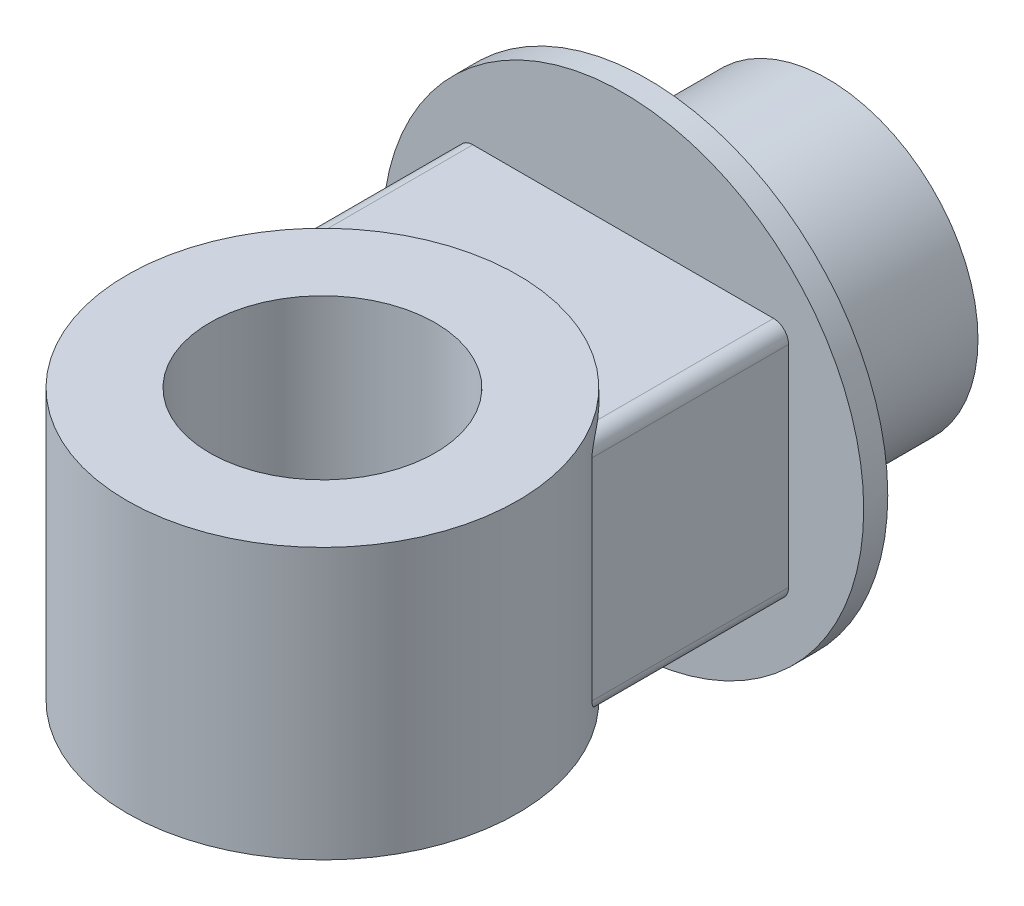
ISO-10303-21;
HEADER;
FILE_DESCRIPTION(('STEP AP214'),'2;1');
FILE_NAME('part.step','',(''),(''),'','','');
FILE_SCHEMA(('AUTOMOTIVE_DESIGN { 1 0 10303 214 1 1 1 1 }'));
ENDSEC;
DATA;
#1=APPLICATION_CONTEXT('core data for automotive mechanical design processes');
#2=APPLICATION_PROTOCOL_DEFINITION('international standard','automotive_design',2000,#1);
#3=PRODUCT_CONTEXT('',#1,'mechanical');
#4=PRODUCT('Part','Part','',(#3));
#5=PRODUCT_RELATED_PRODUCT_CATEGORY('part','',(#4));
#6=PRODUCT_DEFINITION_FORMATION('','',#4);
#7=PRODUCT_DEFINITION_CONTEXT('part definition',#1,'design');
#8=PRODUCT_DEFINITION('design','',#6,#7);
#9=PRODUCT_DEFINITION_SHAPE('','',#8);
#10=(LENGTH_UNIT() NAMED_UNIT(*) SI_UNIT(.MILLI.,.METRE.));
#11=(NAMED_UNIT(*) PLANE_ANGLE_UNIT() SI_UNIT($,.RADIAN.));
#12=(NAMED_UNIT(*) SI_UNIT($,.STERADIAN.) SOLID_ANGLE_UNIT());
#13=UNCERTAINTY_MEASURE_WITH_UNIT(LENGTH_MEASURE(1.E-05),#10,'distance_accuracy_value','');
#14=(GEOMETRIC_REPRESENTATION_CONTEXT(3) GLOBAL_UNCERTAINTY_ASSIGNED_CONTEXT((#13)) GLOBAL_UNIT_ASSIGNED_CONTEXT((#10,
#11,#12)) REPRESENTATION_CONTEXT('',''));
#15=CARTESIAN_POINT('',(0.,0.,0.));
#16=DIRECTION('',(0.,0.,1.));
#17=DIRECTION('',(1.,0.,0.));
#18=AXIS2_PLACEMENT_3D('',#15,#16,#17);
#19=CARTESIAN_POINT('',(0.,0.,120.));
#20=DIRECTION('',(0.,0.,-1.));
#21=DIRECTION('',(-1.,0.,0.));
#22=AXIS2_PLACEMENT_3D('',#19,#20,#21);
#23=CYLINDRICAL_SURFACE('',#22,100.);
#24=CARTESIAN_POINT('',(0.,0.,120.));
#25=DIRECTION('',(0.,0.,1.));
#26=DIRECTION('',(1.,0.,0.));
#27=AXIS2_PLACEMENT_3D('',#24,#25,#26);
#28=CIRCLE('',#27,100.);
#29=CARTESIAN_POINT('',(100.,0.,120.));
#30=VERTEX_POINT('',#29);
#31=EDGE_CURVE('E140',#30,#30,#28,.T.);
#32=ORIENTED_EDGE('',*,*,#31,.F.);
#33=EDGE_LOOP('',(#32));
#34=FACE_BOUND('',#33,.T.);
#35=CARTESIAN_POINT('',(0.,0.,0.));
#36=DIRECTION('',(0.,0.,1.));
#37=DIRECTION('',(1.,0.,0.));
#38=AXIS2_PLACEMENT_3D('',#35,#36,#37);
#39=CIRCLE('',#38,100.);
#40=CARTESIAN_POINT('',(100.,0.,0.));
#41=VERTEX_POINT('',#40);
#42=EDGE_CURVE('E218',#41,#41,#39,.T.);
#43=ORIENTED_EDGE('',*,*,#42,.T.);
#44=EDGE_LOOP('',(#43));
#45=FACE_BOUND('',#44,.T.);
#46=ADVANCED_FACE('F39',(#34,#45),#23,.T.);
#47=CARTESIAN_POINT('',(0.,0.,0.));
#48=DIRECTION('',(0.,0.,1.));
#49=DIRECTION('',(1.,0.,0.));
#50=AXIS2_PLACEMENT_3D('',#47,#48,#49);
#51=PLANE('',#50);
#52=ORIENTED_EDGE('',*,*,#42,.F.);
#53=EDGE_LOOP('',(#52));
#54=FACE_BOUND('',#53,.T.);
#55=ADVANCED_FACE('F226',(#54),#51,.F.);
#56=CARTESIAN_POINT('',(0.,0.,136.));
#57=DIRECTION('',(0.,0.,-1.));
#58=DIRECTION('',(-1.,0.,0.));
#59=AXIS2_PLACEMENT_3D('',#56,#57,#58);
#60=CYLINDRICAL_SURFACE('',#59,160.);
#61=CARTESIAN_POINT('',(0.,0.,136.));
#62=DIRECTION('',(0.,0.,1.));
#63=DIRECTION('',(1.,0.,0.));
#64=AXIS2_PLACEMENT_3D('',#61,#62,#63);
#65=CIRCLE('',#64,160.);
#66=CARTESIAN_POINT('',(160.,0.,136.));
#67=VERTEX_POINT('',#66);
#68=EDGE_CURVE('E215',#67,#67,#65,.T.);
#69=ORIENTED_EDGE('',*,*,#68,.F.);
#70=EDGE_LOOP('',(#69));
#71=FACE_BOUND('',#70,.T.);
#72=CARTESIAN_POINT('',(0.,0.,120.));
#73=DIRECTION('',(0.,0.,1.));
#74=DIRECTION('',(1.,0.,0.));
#75=AXIS2_PLACEMENT_3D('',#72,#73,#74);
#76=CIRCLE('',#75,160.);
#77=CARTESIAN_POINT('',(160.,0.,120.));
#78=VERTEX_POINT('',#77);
#79=EDGE_CURVE('E132',#78,#78,#76,.T.);
#80=ORIENTED_EDGE('',*,*,#79,.T.);
#81=EDGE_LOOP('',(#80));
#82=FACE_BOUND('',#81,.T.);
#83=ADVANCED_FACE('F228',(#71,#82),#60,.T.);
#84=CARTESIAN_POINT('',(0.,0.,136.));
#85=DIRECTION('',(0.,0.,1.));
#86=DIRECTION('',(1.,0.,0.));
#87=AXIS2_PLACEMENT_3D('',#84,#85,#86);
#88=PLANE('',#87);
#89=DIRECTION('',(0.,1.,0.));
#90=VECTOR('',#89,1.);
#91=CARTESIAN_POINT('',(110.,80.,136.));
#92=LINE('',#91,#90);
#93=CARTESIAN_POINT('',(110.,-70.,136.));
#94=VERTEX_POINT('',#93);
#95=CARTESIAN_POINT('',(110.,70.,136.));
#96=VERTEX_POINT('',#95);
#97=EDGE_CURVE('E192',#94,#96,#92,.T.);
#98=ORIENTED_EDGE('',*,*,#97,.F.);
#99=CARTESIAN_POINT('',(100.,-70.,136.));
#100=DIRECTION('',(0.,0.,1.));
#101=DIRECTION('',(1.,0.,0.));
#102=AXIS2_PLACEMENT_3D('',#99,#100,#101);
#103=CIRCLE('',#102,10.);
#104=CARTESIAN_POINT('',(100.,-80.,136.));
#105=VERTEX_POINT('',#104);
#106=EDGE_CURVE('E121',#94,#105,#103,.F.);
#107=ORIENTED_EDGE('',*,*,#106,.T.);
#108=DIRECTION('',(1.,0.,0.));
#109=VECTOR('',#108,1.);
#110=CARTESIAN_POINT('',(-110.,-80.,136.));
#111=LINE('',#110,#109);
#112=CARTESIAN_POINT('',(-100.,-80.,136.));
#113=VERTEX_POINT('',#112);
#114=EDGE_CURVE('E199',#113,#105,#111,.T.);
#115=ORIENTED_EDGE('',*,*,#114,.F.);
#116=CARTESIAN_POINT('',(-100.,-70.,136.));
#117=DIRECTION('',(0.,0.,1.));
#118=DIRECTION('',(1.,0.,0.));
#119=AXIS2_PLACEMENT_3D('',#116,#117,#118);
#120=CIRCLE('',#119,10.);
#121=CARTESIAN_POINT('',(-110.,-70.,136.));
#122=VERTEX_POINT('',#121);
#123=EDGE_CURVE('E122',#113,#122,#120,.F.);
#124=ORIENTED_EDGE('',*,*,#123,.T.);
#125=DIRECTION('',(0.,-1.,0.));
#126=VECTOR('',#125,1.);
#127=CARTESIAN_POINT('',(-110.,80.,136.));
#128=LINE('',#127,#126);
#129=CARTESIAN_POINT('',(-110.,70.,136.));
#130=VERTEX_POINT('',#129);
#131=EDGE_CURVE('E368',#130,#122,#128,.T.);
#132=ORIENTED_EDGE('',*,*,#131,.F.);
#133=CARTESIAN_POINT('',(-100.,70.,136.));
#134=DIRECTION('',(0.,0.,1.));
#135=DIRECTION('',(1.,0.,0.));
#136=AXIS2_PLACEMENT_3D('',#133,#134,#135);
#137=CIRCLE('',#136,10.);
#138=CARTESIAN_POINT('',(-100.,80.,136.));
#139=VERTEX_POINT('',#138);
#140=EDGE_CURVE('E60',#130,#139,#137,.F.);
#141=ORIENTED_EDGE('',*,*,#140,.T.);
#142=DIRECTION('',(-1.,0.,0.));
#143=VECTOR('',#142,1.);
#144=CARTESIAN_POINT('',(-110.,80.,136.));
#145=LINE('',#144,#143);
#146=CARTESIAN_POINT('',(100.,80.,136.));
#147=VERTEX_POINT('',#146);
#148=EDGE_CURVE('E193',#147,#139,#145,.T.);
#149=ORIENTED_EDGE('',*,*,#148,.F.);
#150=CARTESIAN_POINT('',(100.,70.,136.));
#151=DIRECTION('',(0.,0.,1.));
#152=DIRECTION('',(1.,0.,0.));
#153=AXIS2_PLACEMENT_3D('',#150,#151,#152);
#154=CIRCLE('',#153,10.);
#155=EDGE_CURVE('E53',#147,#96,#154,.F.);
#156=ORIENTED_EDGE('',*,*,#155,.T.);
#157=EDGE_LOOP('',(#98,#107,#115,#124,#132,#141,#149,#156));
#158=FACE_BOUND('',#157,.T.);
#159=ORIENTED_EDGE('',*,*,#68,.T.);
#160=EDGE_LOOP('',(#159));
#161=FACE_BOUND('',#160,.T.);
#162=ADVANCED_FACE('F190',(#158,#161),#88,.T.);
#163=CARTESIAN_POINT('',(0.,0.,120.));
#164=DIRECTION('',(0.,0.,1.));
#165=DIRECTION('',(1.,0.,0.));
#166=AXIS2_PLACEMENT_3D('',#163,#164,#165);
#167=PLANE('',#166);
#168=ORIENTED_EDGE('',*,*,#31,.T.);
#169=EDGE_LOOP('',(#168));
#170=FACE_BOUND('',#169,.T.);
#171=ORIENTED_EDGE('',*,*,#79,.F.);
#172=EDGE_LOOP('',(#171));
#173=FACE_BOUND('',#172,.T.);
#174=ADVANCED_FACE('F237',(#170,#173),#167,.F.);
#175=CARTESIAN_POINT('',(-110.,80.,466.002));
#176=DIRECTION('',(0.,-1.,0.));
#177=DIRECTION('',(0.,0.,-1.));
#178=AXIS2_PLACEMENT_3D('',#175,#176,#177);
#179=PLANE('',#178);
#180=ORIENTED_EDGE('',*,*,#148,.T.);
#181=DIRECTION('',(0.,0.,-1.));
#182=VECTOR('',#181,1.);
#183=CARTESIAN_POINT('',(-100.,80.,466.002));
#184=LINE('',#183,#182);
#185=CARTESIAN_POINT('',(-100.,80.,252.933761370819));
#186=VERTEX_POINT('',#185);
#187=EDGE_CURVE('E152',#139,#186,#184,.F.);
#188=ORIENTED_EDGE('',*,*,#187,.T.);
#189=CARTESIAN_POINT('',(0.,80.,336.));
#190=DIRECTION('',(0.,-1.,0.));
#191=DIRECTION('',(0.,0.,-1.));
#192=AXIS2_PLACEMENT_3D('',#189,#190,#191);
#193=CIRCLE('',#192,130.);
#194=CARTESIAN_POINT('',(100.,80.,252.933761370819));
#195=VERTEX_POINT('',#194);
#196=EDGE_CURVE('E205',#195,#186,#193,.F.);
#197=ORIENTED_EDGE('',*,*,#196,.F.);
#198=DIRECTION('',(0.,0.,-1.));
#199=VECTOR('',#198,1.);
#200=CARTESIAN_POINT('',(100.,80.,466.002));
#201=LINE('',#200,#199);
#202=EDGE_CURVE('E150',#195,#147,#201,.T.);
#203=ORIENTED_EDGE('',*,*,#202,.T.);
#204=EDGE_LOOP('',(#180,#188,#197,#203));
#205=FACE_BOUND('',#204,.T.);
#206=ADVANCED_FACE('F209',(#205),#179,.F.);
#207=CARTESIAN_POINT('',(110.,80.,466.002));
#208=DIRECTION('',(-1.,0.,0.));
#209=DIRECTION('',(0.,-1.,0.));
#210=AXIS2_PLACEMENT_3D('',#207,#208,#209);
#211=PLANE('',#210);
#212=DIRECTION('',(0.,-1.,0.));
#213=VECTOR('',#212,1.);
#214=CARTESIAN_POINT('',(110.,90.,266.717967697245));
#215=LINE('',#214,#213);
#216=CARTESIAN_POINT('',(110.,-70.,266.717967697245));
#217=VERTEX_POINT('',#216);
#218=CARTESIAN_POINT('',(110.,70.,266.717967697245));
#219=VERTEX_POINT('',#218);
#220=EDGE_CURVE('E207',#217,#219,#215,.F.);
#221=ORIENTED_EDGE('',*,*,#220,.F.);
#222=DIRECTION('',(0.,0.,-1.));
#223=VECTOR('',#222,1.);
#224=CARTESIAN_POINT('',(110.,-70.,466.002));
#225=LINE('',#224,#223);
#226=EDGE_CURVE('E147',#217,#94,#225,.T.);
#227=ORIENTED_EDGE('',*,*,#226,.T.);
#228=ORIENTED_EDGE('',*,*,#97,.T.);
#229=DIRECTION('',(0.,0.,-1.));
#230=VECTOR('',#229,1.);
#231=CARTESIAN_POINT('',(110.,70.,466.002));
#232=LINE('',#231,#230);
#233=EDGE_CURVE('E145',#96,#219,#232,.F.);
#234=ORIENTED_EDGE('',*,*,#233,.T.);
#235=EDGE_LOOP('',(#221,#227,#228,#234));
#236=FACE_BOUND('',#235,.T.);
#237=ADVANCED_FACE('F196',(#236),#211,.F.);
#238=CARTESIAN_POINT('',(-110.,80.,466.002));
#239=DIRECTION('',(1.,0.,0.));
#240=DIRECTION('',(0.,1.,0.));
#241=AXIS2_PLACEMENT_3D('',#238,#239,#240);
#242=PLANE('',#241);
#243=ORIENTED_EDGE('',*,*,#131,.T.);
#244=DIRECTION('',(0.,0.,-1.));
#245=VECTOR('',#244,1.);
#246=CARTESIAN_POINT('',(-110.,-70.,466.002));
#247=LINE('',#246,#245);
#248=CARTESIAN_POINT('',(-110.,-69.9999999999999,266.717967697245));
#249=VERTEX_POINT('',#248);
#250=EDGE_CURVE('E138',#122,#249,#247,.F.);
#251=ORIENTED_EDGE('',*,*,#250,.T.);
#252=DIRECTION('',(0.,-1.,0.));
#253=VECTOR('',#252,1.);
#254=CARTESIAN_POINT('',(-110.,90.,266.717967697245));
#255=LINE('',#254,#253);
#256=CARTESIAN_POINT('',(-110.,70.,266.717967697245));
#257=VERTEX_POINT('',#256);
#258=EDGE_CURVE('E117',#257,#249,#255,.T.);
#259=ORIENTED_EDGE('',*,*,#258,.F.);
#260=DIRECTION('',(0.,0.,-1.));
#261=VECTOR('',#260,1.);
#262=CARTESIAN_POINT('',(-110.,70.,466.002));
#263=LINE('',#262,#261);
#264=EDGE_CURVE('E135',#257,#130,#263,.T.);
#265=ORIENTED_EDGE('',*,*,#264,.T.);
#266=EDGE_LOOP('',(#243,#251,#259,#265));
#267=FACE_BOUND('',#266,.T.);
#268=ADVANCED_FACE('F245',(#267),#242,.F.);
#269=CARTESIAN_POINT('',(-110.,-80.,466.002));
#270=DIRECTION('',(0.,1.,0.));
#271=DIRECTION('',(0.,0.,1.));
#272=AXIS2_PLACEMENT_3D('',#269,#270,#271);
#273=PLANE('',#272);
#274=CARTESIAN_POINT('',(0.,-80.,336.));
#275=DIRECTION('',(0.,1.,0.));
#276=DIRECTION('',(0.,0.,1.));
#277=AXIS2_PLACEMENT_3D('',#274,#275,#276);
#278=CIRCLE('',#277,130.);
#279=CARTESIAN_POINT('',(-100.,-80.,252.933761370819));
#280=VERTEX_POINT('',#279);
#281=CARTESIAN_POINT('',(100.,-80.,252.933761370819));
#282=VERTEX_POINT('',#281);
#283=EDGE_CURVE('E114',#280,#282,#278,.F.);
#284=ORIENTED_EDGE('',*,*,#283,.F.);
#285=DIRECTION('',(0.,0.,-1.));
#286=VECTOR('',#285,1.);
#287=CARTESIAN_POINT('',(-100.,-80.,466.002));
#288=LINE('',#287,#286);
#289=EDGE_CURVE('E128',#280,#113,#288,.T.);
#290=ORIENTED_EDGE('',*,*,#289,.T.);
#291=ORIENTED_EDGE('',*,*,#114,.T.);
#292=DIRECTION('',(0.,0.,-1.));
#293=VECTOR('',#292,1.);
#294=CARTESIAN_POINT('',(100.,-80.,466.002));
#295=LINE('',#294,#293);
#296=EDGE_CURVE('E131',#105,#282,#295,.F.);
#297=ORIENTED_EDGE('',*,*,#296,.T.);
#298=EDGE_LOOP('',(#284,#290,#291,#297));
#299=FACE_BOUND('',#298,.T.);
#300=ADVANCED_FACE('F126',(#299),#273,.F.);
#301=CARTESIAN_POINT('',(0.,90.,336.));
#302=DIRECTION('',(0.,-1.,0.));
#303=DIRECTION('',(0.,0.,-1.));
#304=AXIS2_PLACEMENT_3D('',#301,#302,#303);
#305=CYLINDRICAL_SURFACE('',#304,130.);
#306=CARTESIAN_POINT('',(0.,90.,336.));
#307=DIRECTION('',(0.,1.,0.));
#308=DIRECTION('',(0.,0.,1.));
#309=AXIS2_PLACEMENT_3D('',#306,#307,#308);
#310=CIRCLE('',#309,130.);
#311=CARTESIAN_POINT('',(0.,90.,466.));
#312=VERTEX_POINT('',#311);
#313=EDGE_CURVE('E200',#312,#312,#310,.T.);
#314=ORIENTED_EDGE('',*,*,#313,.F.);
#315=EDGE_LOOP('',(#314));
#316=FACE_BOUND('',#315,.T.);
#317=CARTESIAN_POINT('',(0.,-90.,336.));
#318=DIRECTION('',(0.,1.,0.));
#319=DIRECTION('',(0.,0.,1.));
#320=AXIS2_PLACEMENT_3D('',#317,#318,#319);
#321=CIRCLE('',#320,130.);
#322=CARTESIAN_POINT('',(0.,-90.,466.));
#323=VERTEX_POINT('',#322);
#324=EDGE_CURVE('E373',#323,#323,#321,.T.);
#325=ORIENTED_EDGE('',*,*,#324,.T.);
#326=EDGE_LOOP('',(#325));
#327=FACE_BOUND('',#326,.T.);
#328=ORIENTED_EDGE('',*,*,#283,.T.);
#329=CARTESIAN_POINT('',(100.,-80.,252.933761370819));
#330=CARTESIAN_POINT('',(100.223611151915,-79.9999830665315,253.202952503255));
#331=CARTESIAN_POINT('',(100.446118360057,-79.9924995885085,253.473036166024));
#332=CARTESIAN_POINT('',(100.888548742496,-79.9629173131463,254.014496760122));
#333=CARTESIAN_POINT('',(101.10847204376,-79.9408192370116,254.285873626978));
#334=CARTESIAN_POINT('',(101.545586290072,-79.8822979337703,254.829711400373));
#335=CARTESIAN_POINT('',(101.76277446753,-79.8458612385231,255.102173087004));
#336=CARTESIAN_POINT('',(102.193849033468,-79.7588609087488,255.647413797012));
#337=CARTESIAN_POINT('',(102.407735374993,-79.7082970735217,255.920192824843));
#338=CARTESIAN_POINT('',(103.048408055095,-79.5343891784366,256.74400885936));
#339=CARTESIAN_POINT('',(103.469748368072,-79.3894263280958,257.294974230618));
#340=CARTESIAN_POINT('',(104.088382224678,-79.1288060997198,258.117224843771));
#341=CARTESIAN_POINT('',(104.292337034927,-79.0347525474725,258.39057162742));
#342=CARTESIAN_POINT('',(104.695498702643,-78.8319429710982,258.935304765081));
#343=CARTESIAN_POINT('',(104.894706004332,-78.7231883289499,259.206691300842));
#344=CARTESIAN_POINT('',(105.336170271764,-78.4620472638272,259.812965668139));
#345=CARTESIAN_POINT('',(105.577006541077,-78.3055009036513,260.147108038148));
#346=CARTESIAN_POINT('',(106.049660949871,-77.967808626391,260.809343252621));
#347=CARTESIAN_POINT('',(106.281479043935,-77.7866625854443,261.137436066616));
#348=CARTESIAN_POINT('',(106.734152264033,-77.3986376161628,261.784259610706));
#349=CARTESIAN_POINT('',(106.955036134368,-77.1918317878757,262.103013877599));
#350=CARTESIAN_POINT('',(107.384708325122,-76.749894392022,262.728803605627));
#351=CARTESIAN_POINT('',(107.593501627276,-76.5147746155492,263.035843875289));
#352=CARTESIAN_POINT('',(107.921279015409,-76.1068757916446,263.522080966667));
#353=CARTESIAN_POINT('',(108.044709884718,-75.9435605188262,263.706240813683));
#354=CARTESIAN_POINT('',(108.284949666933,-75.6038296157538,264.066582834907));
#355=CARTESIAN_POINT('',(108.401760304956,-75.4274174262628,264.242767084987));
#356=CARTESIAN_POINT('',(108.627683741988,-75.0605773993746,264.585236991633));
#357=CARTESIAN_POINT('',(108.736797961361,-74.8701521613912,264.751524473746));
#358=CARTESIAN_POINT('',(108.945874410432,-74.4745306992527,265.071634412635));
#359=CARTESIAN_POINT('',(109.04583974995,-74.2693395369045,265.225461102935));
#360=CARTESIAN_POINT('',(109.274660386151,-73.7536743100227,265.579056080623));
#361=CARTESIAN_POINT('',(109.398046362816,-73.4351396850742,265.771031349643));
#362=CARTESIAN_POINT('',(109.561336457207,-72.9345418523035,266.026263049993));
#363=CARTESIAN_POINT('',(109.612072269395,-72.7641622498837,266.105785634321));
#364=CARTESIAN_POINT('',(109.705421847597,-72.4160328323222,266.25239837099));
#365=CARTESIAN_POINT('',(109.748040656091,-72.2382876769632,266.319496241142));
#366=CARTESIAN_POINT('',(109.820262744001,-71.8947331689276,266.433384610412));
#367=CARTESIAN_POINT('',(109.850752312767,-71.729567610939,266.481551609067));
#368=CARTESIAN_POINT('',(109.903691363628,-71.3948451418076,266.565274678988));
#369=CARTESIAN_POINT('',(109.926143541964,-71.2252897238033,266.600834979285));
#370=CARTESIAN_POINT('',(109.962659042777,-70.8807814271977,266.658707696818));
#371=CARTESIAN_POINT('',(109.976613864032,-70.7057875562757,266.680848750137));
#372=CARTESIAN_POINT('',(109.99061964662,-70.4419386674803,266.703076138542));
#373=CARTESIAN_POINT('',(109.99413386492,-70.3536902139711,266.708654625172));
#374=CARTESIAN_POINT('',(109.998824989492,-70.1769662160103,266.716102079046));
#375=CARTESIAN_POINT('',(110.000001659485,-70.0884906495071,266.717970671296));
#376=CARTESIAN_POINT('',(110.,-70.,266.717967697245));
#377=B_SPLINE_CURVE_WITH_KNOTS('',3,(#329,#330,#331,#332,#333,#334,#335,#336,#337,#338,#339,
#340,#341,#342,#343,#344,#345,#346,#347,#348,#349,#350,#351,#352,#353,#354,#355,#356,#357,#358,
#359,#360,#361,#362,#363,#364,#365,#366,#367,#368,#369,#370,#371,#372,#373,#374,#375,#376),
.UNSPECIFIED.,.F.,.F.,(4,2,2,2,2,2,2,2,2,2,2,2,2,2,2,2,2,2,2,2,2,2,2,4),(0.,1.04974156507777,
2.09943133114573,3.15010942417272,4.20080244462032,6.32356278933861,7.38465211465328,
8.44564176134501,9.76677685539399,11.087918601761,12.4053795382949,13.7222937149078,
14.5479419827465,15.3733741023699,16.1986534888326,17.023651302289,18.194686650492,
18.7783719827905,19.3616935243416,19.8852298594993,20.4085904030381,20.9385006934629,
21.2038887699912,21.4693036704869),.UNSPECIFIED.);
#378=EDGE_CURVE('E176',#282,#217,#377,.T.);
#379=ORIENTED_EDGE('',*,*,#378,.T.);
#380=ORIENTED_EDGE('',*,*,#220,.T.);
#381=CARTESIAN_POINT('',(110.,70.,266.717967697245));
#382=CARTESIAN_POINT('',(110.000033683462,70.1614230595313,266.718025852698));
#383=CARTESIAN_POINT('',(109.996092792414,70.3228118197691,266.711764254296));
#384=CARTESIAN_POINT('',(109.980519982779,70.6441123999957,266.687045880384));
#385=CARTESIAN_POINT('',(109.968896213713,70.8040256031146,266.668602027069));
#386=CARTESIAN_POINT('',(109.938376398954,71.1196424551221,266.620217986395));
#387=CARTESIAN_POINT('',(109.919558261622,71.2753727040436,266.590400967593));
#388=CARTESIAN_POINT('',(109.875071558334,71.5834085562726,266.52000006118));
#389=CARTESIAN_POINT('',(109.849400846184,71.7357130704249,266.479412800404));
#390=CARTESIAN_POINT('',(109.784772267017,72.0722520040974,266.377386983169));
#391=CARTESIAN_POINT('',(109.744103525393,72.2553511890568,266.313281105856));
#392=CARTESIAN_POINT('',(109.654040532803,72.6141464391851,266.17165023193));
#393=CARTESIAN_POINT('',(109.604640075501,72.7898371277864,266.094115691273));
#394=CARTESIAN_POINT('',(109.497968805892,73.133872391345,265.927147418338));
#395=CARTESIAN_POINT('',(109.440667457039,73.302184951541,265.837667562915));
#396=CARTESIAN_POINT('',(109.319341126161,73.6304969218558,265.648779195145));
#397=CARTESIAN_POINT('',(109.25531768694,73.7904982269664,265.549372961282));
#398=CARTESIAN_POINT('',(109.085069343255,74.1868876463209,265.28590129292));
#399=CARTESIAN_POINT('',(108.974781990569,74.4176642111939,265.115997241409));
#400=CARTESIAN_POINT('',(108.742772943656,74.8607110351426,264.76058359918));
#401=CARTESIAN_POINT('',(108.621044869784,75.072970840064,264.575065307649));
#402=CARTESIAN_POINT('',(108.36794946479,75.4804206329535,264.19164129378));
#403=CARTESIAN_POINT('',(108.236568322626,75.6755852518652,263.993717884812));
#404=CARTESIAN_POINT('',(107.965814499919,76.0497203250662,263.588382733388));
#405=CARTESIAN_POINT('',(107.826442440892,76.2286920360201,263.380971729107));
#406=CARTESIAN_POINT('',(107.56145650763,76.5468161797372,262.989174407744));
#407=CARTESIAN_POINT('',(107.436764821801,76.6879854690674,262.805791987749));
#408=CARTESIAN_POINT('',(107.182869679799,76.9599552926783,262.434497987953));
#409=CARTESIAN_POINT('',(107.053665586411,77.0907543539386,262.24658576965));
#410=CARTESIAN_POINT('',(106.659844344167,77.4685356621902,261.677121003612));
#411=CARTESIAN_POINT('',(106.389102445143,77.7008024816961,261.289965080353));
#412=CARTESIAN_POINT('',(105.833418194947,78.129863631631,260.504836154638));
#413=CARTESIAN_POINT('',(105.548442441802,78.3265689888296,260.106838810795));
#414=CARTESIAN_POINT('',(104.96676628824,78.6860846955171,259.304344779382));
#415=CARTESIAN_POINT('',(104.670068038633,78.8489012287858,258.899849292081));
#416=CARTESIAN_POINT('',(104.024574509401,79.1623550419402,258.030646711215));
#417=CARTESIAN_POINT('',(103.674248758637,79.3081944572228,257.565348460988));
#418=CARTESIAN_POINT('',(102.961876677953,79.558756520093,256.632523338709));
#419=CARTESIAN_POINT('',(102.599828734006,79.6634734792563,256.16499616738));
#420=CARTESIAN_POINT('',(102.051092736822,79.7891645729388,255.466397204689));
#421=CARTESIAN_POINT('',(101.868137468165,79.8257282191264,255.235094848973));
#422=CARTESIAN_POINT('',(101.499966150616,79.8886289353229,254.77288550036));
#423=CARTESIAN_POINT('',(101.314750133026,79.9149661467555,254.541978502041));
#424=CARTESIAN_POINT('',(100.942320486513,79.9572665465168,254.080919722901));
#425=CARTESIAN_POINT('',(100.755107350153,79.9732322353467,253.850767773367));
#426=CARTESIAN_POINT('',(100.378860262163,79.9945948234744,253.391449185777));
#427=CARTESIAN_POINT('',(100.189826234412,79.9999912789888,253.162282589497));
#428=CARTESIAN_POINT('',(100.,80.,252.933761370819));
#429=B_SPLINE_CURVE_WITH_KNOTS('',3,(#381,#382,#383,#384,#385,#386,#387,#388,#389,#390,#391,
#392,#393,#394,#395,#396,#397,#398,#399,#400,#401,#402,#403,#404,#405,#406,#407,#408,#409,#410,
#411,#412,#413,#414,#415,#416,#417,#418,#419,#420,#421,#422,#423,#424,#425,#426,#427,#428),
.UNSPECIFIED.,.F.,.F.,(4,2,2,2,2,2,2,2,2,2,2,2,2,2,2,2,2,2,2,2,2,2,2,4),(0.,0.484045005923083,
0.96757738914542,1.44601544684507,1.92460352520313,2.51835043890465,3.11252108624072,
3.70905613988738,4.30545457926274,5.22516595363372,6.14539326092329,7.06696382284192,
7.98846280401962,8.77680092000541,9.56525081419894,11.1426900482286,12.7240229357797,
14.305067020047,16.1047501551829,17.9046821508918,18.7960435003638,19.6873925225409,
20.5785265668947,21.4696980275819),.UNSPECIFIED.);
#430=EDGE_CURVE('E11',#219,#195,#429,.T.);
#431=ORIENTED_EDGE('',*,*,#430,.T.);
#432=ORIENTED_EDGE('',*,*,#196,.T.);
#433=CARTESIAN_POINT('',(-100.,80.,252.933761370819));
#434=CARTESIAN_POINT('',(-100.223611151915,79.9999830665315,253.202952503255));
#435=CARTESIAN_POINT('',(-100.446118360057,79.9924995885085,253.473036166024));
#436=CARTESIAN_POINT('',(-100.888548742496,79.9629173131463,254.014496760122));
#437=CARTESIAN_POINT('',(-101.108472043759,79.9408192370115,254.285873626978));
#438=CARTESIAN_POINT('',(-101.545586290072,79.8822979337703,254.829711400373));
#439=CARTESIAN_POINT('',(-101.76277446753,79.8458612385231,255.102173087004));
#440=CARTESIAN_POINT('',(-102.193849033468,79.7588609087488,255.647413797012));
#441=CARTESIAN_POINT('',(-102.407735374993,79.7082970735217,255.920192824843));
#442=CARTESIAN_POINT('',(-103.048408055095,79.5343891784366,256.74400885936));
#443=CARTESIAN_POINT('',(-103.469748368072,79.3894263280958,257.294974230618));
#444=CARTESIAN_POINT('',(-104.088382224678,79.1288060997197,258.117224843771));
#445=CARTESIAN_POINT('',(-104.292337034927,79.0347525474724,258.39057162742));
#446=CARTESIAN_POINT('',(-104.695498702643,78.8319429710982,258.935304765081));
#447=CARTESIAN_POINT('',(-104.894706004332,78.7231883289499,259.206691300842));
#448=CARTESIAN_POINT('',(-105.336170271764,78.4620472638272,259.812965668139));
#449=CARTESIAN_POINT('',(-105.577006541077,78.3055009036513,260.147108038148));
#450=CARTESIAN_POINT('',(-106.04966094987,77.967808626391,260.809343252621));
#451=CARTESIAN_POINT('',(-106.281479043935,77.7866625854444,261.137436066616));
#452=CARTESIAN_POINT('',(-106.734152264033,77.3986376161628,261.784259610706));
#453=CARTESIAN_POINT('',(-106.955036134368,77.1918317878757,262.103013877598));
#454=CARTESIAN_POINT('',(-107.384708325122,76.749894392022,262.728803605627));
#455=CARTESIAN_POINT('',(-107.593501627276,76.5147746155492,263.035843875289));
#456=CARTESIAN_POINT('',(-107.921279015409,76.1068757916446,263.522080966666));
#457=CARTESIAN_POINT('',(-108.044709884718,75.9435605188263,263.706240813682));
#458=CARTESIAN_POINT('',(-108.284949666933,75.6038296157538,264.066582834907));
#459=CARTESIAN_POINT('',(-108.401760304956,75.4274174262629,264.242767084986));
#460=CARTESIAN_POINT('',(-108.627683741988,75.0605773993746,264.585236991633));
#461=CARTESIAN_POINT('',(-108.736797961361,74.8701521613913,264.751524473746));
#462=CARTESIAN_POINT('',(-108.945874410432,74.4745306992528,265.071634412635));
#463=CARTESIAN_POINT('',(-109.04583974995,74.2693395369045,265.225461102935));
#464=CARTESIAN_POINT('',(-109.274660386151,73.7536743100227,265.579056080623));
#465=CARTESIAN_POINT('',(-109.398046362816,73.4351396850742,265.771031349643));
#466=CARTESIAN_POINT('',(-109.561336457207,72.9345418523036,266.026263049992));
#467=CARTESIAN_POINT('',(-109.612072269395,72.7641622498837,266.105785634321));
#468=CARTESIAN_POINT('',(-109.705421847597,72.4160328323223,266.25239837099));
#469=CARTESIAN_POINT('',(-109.748040656091,72.2382876769633,266.319496241142));
#470=CARTESIAN_POINT('',(-109.820262744001,71.8947331689277,266.433384610412));
#471=CARTESIAN_POINT('',(-109.850752312767,71.7295676109391,266.481551609067));
#472=CARTESIAN_POINT('',(-109.903691363628,71.3948451418076,266.565274678987));
#473=CARTESIAN_POINT('',(-109.926143541964,71.2252897238033,266.600834979285));
#474=CARTESIAN_POINT('',(-109.962659042777,70.8807814271977,266.658707696818));
#475=CARTESIAN_POINT('',(-109.976613864032,70.7057875562757,266.680848750137));
#476=CARTESIAN_POINT('',(-109.99061964662,70.4419386674803,266.703076138542));
#477=CARTESIAN_POINT('',(-109.99413386492,70.3536902139711,266.708654625171));
#478=CARTESIAN_POINT('',(-109.998824989492,70.1769662160102,266.716102079046));
#479=CARTESIAN_POINT('',(-110.000001659485,70.088490649507,266.717970671296));
#480=CARTESIAN_POINT('',(-110.,70.,266.717967697245));
#481=B_SPLINE_CURVE_WITH_KNOTS('',3,(#433,#434,#435,#436,#437,#438,#439,#440,#441,#442,#443,
#444,#445,#446,#447,#448,#449,#450,#451,#452,#453,#454,#455,#456,#457,#458,#459,#460,#461,#462,
#463,#464,#465,#466,#467,#468,#469,#470,#471,#472,#473,#474,#475,#476,#477,#478,#479,#480),
.UNSPECIFIED.,.F.,.F.,(4,2,2,2,2,2,2,2,2,2,2,2,2,2,2,2,2,2,2,2,2,2,2,4),(0.,1.04974156507782,
2.09943133114566,3.15010942417265,4.20080244462031,6.3235627893386,7.38465211465333,
8.44564176134499,9.76677685539395,11.087918601761,12.4053795382948,13.7222937149077,
14.5479419827464,15.3733741023698,16.1986534888326,17.023651302289,18.194686650492,
18.7783719827905,19.3616935243415,19.8852298594992,20.408590403038,20.9385006934629,
21.2038887699912,21.4693036704869),.UNSPECIFIED.);
#482=EDGE_CURVE('E183',#186,#257,#481,.T.);
#483=ORIENTED_EDGE('',*,*,#482,.T.);
#484=ORIENTED_EDGE('',*,*,#258,.T.);
#485=CARTESIAN_POINT('',(-110.,-70.,266.717967697245));
#486=CARTESIAN_POINT('',(-110.000033683462,-70.1614230595313,266.718025852698));
#487=CARTESIAN_POINT('',(-109.996092792414,-70.3228118197691,266.711764254296));
#488=CARTESIAN_POINT('',(-109.980519982779,-70.6441123999957,266.687045880384));
#489=CARTESIAN_POINT('',(-109.968896213713,-70.8040256031146,266.668602027069));
#490=CARTESIAN_POINT('',(-109.938376398954,-71.1196424551221,266.620217986395));
#491=CARTESIAN_POINT('',(-109.919558261622,-71.2753727040436,266.590400967593));
#492=CARTESIAN_POINT('',(-109.875071558334,-71.5834085562726,266.52000006118));
#493=CARTESIAN_POINT('',(-109.849400846184,-71.7357130704249,266.479412800404));
#494=CARTESIAN_POINT('',(-109.784772267017,-72.0722520040974,266.377386983169));
#495=CARTESIAN_POINT('',(-109.744103525393,-72.2553511890568,266.313281105856));
#496=CARTESIAN_POINT('',(-109.654040532803,-72.6141464391851,266.17165023193));
#497=CARTESIAN_POINT('',(-109.604640075501,-72.7898371277865,266.094115691273));
#498=CARTESIAN_POINT('',(-109.497968805892,-73.133872391345,265.927147418338));
#499=CARTESIAN_POINT('',(-109.440667457039,-73.302184951541,265.837667562915));
#500=CARTESIAN_POINT('',(-109.319341126161,-73.6304969218558,265.648779195145));
#501=CARTESIAN_POINT('',(-109.25531768694,-73.7904982269664,265.549372961282));
#502=CARTESIAN_POINT('',(-109.085069343255,-74.1868876463209,265.28590129292));
#503=CARTESIAN_POINT('',(-108.974781990569,-74.4176642111939,265.115997241409));
#504=CARTESIAN_POINT('',(-108.742772943656,-74.8607110351426,264.76058359918));
#505=CARTESIAN_POINT('',(-108.621044869784,-75.072970840064,264.575065307649));
#506=CARTESIAN_POINT('',(-108.36794946479,-75.4804206329535,264.19164129378));
#507=CARTESIAN_POINT('',(-108.236568322626,-75.6755852518652,263.993717884812));
#508=CARTESIAN_POINT('',(-107.965814499919,-76.0497203250662,263.588382733387));
#509=CARTESIAN_POINT('',(-107.826442440892,-76.2286920360201,263.380971729107));
#510=CARTESIAN_POINT('',(-107.56145650763,-76.5468161797372,262.989174407744));
#511=CARTESIAN_POINT('',(-107.436764821801,-76.6879854690674,262.805791987749));
#512=CARTESIAN_POINT('',(-107.182869679799,-76.9599552926783,262.434497987953));
#513=CARTESIAN_POINT('',(-107.053665586411,-77.0907543539386,262.24658576965));
#514=CARTESIAN_POINT('',(-106.659844344167,-77.4685356621902,261.677121003612));
#515=CARTESIAN_POINT('',(-106.389102445143,-77.7008024816961,261.289965080353));
#516=CARTESIAN_POINT('',(-105.833418194947,-78.129863631631,260.504836154638));
#517=CARTESIAN_POINT('',(-105.548442441802,-78.3265689888296,260.106838810795));
#518=CARTESIAN_POINT('',(-104.96676628824,-78.6860846955171,259.304344779382));
#519=CARTESIAN_POINT('',(-104.670068038633,-78.8489012287858,258.899849292081));
#520=CARTESIAN_POINT('',(-104.024574509401,-79.1623550419402,258.030646711215));
#521=CARTESIAN_POINT('',(-103.674248758637,-79.3081944572228,257.565348460988));
#522=CARTESIAN_POINT('',(-102.961876677953,-79.558756520093,256.632523338709));
#523=CARTESIAN_POINT('',(-102.599828734006,-79.6634734792563,256.16499616738));
#524=CARTESIAN_POINT('',(-102.051092736822,-79.7891645729387,255.466397204689));
#525=CARTESIAN_POINT('',(-101.868137468165,-79.8257282191264,255.235094848973));
#526=CARTESIAN_POINT('',(-101.499966150616,-79.8886289353229,254.77288550036));
#527=CARTESIAN_POINT('',(-101.314750133026,-79.9149661467555,254.541978502041));
#528=CARTESIAN_POINT('',(-100.942320486513,-79.9572665465168,254.080919722901));
#529=CARTESIAN_POINT('',(-100.755107350153,-79.9732322353467,253.850767773367));
#530=CARTESIAN_POINT('',(-100.378860262163,-79.9945948234744,253.391449185777));
#531=CARTESIAN_POINT('',(-100.189826234412,-79.9999912789888,253.162282589497));
#532=CARTESIAN_POINT('',(-100.,-80.,252.933761370819));
#533=B_SPLINE_CURVE_WITH_KNOTS('',3,(#485,#486,#487,#488,#489,#490,#491,#492,#493,#494,#495,
#496,#497,#498,#499,#500,#501,#502,#503,#504,#505,#506,#507,#508,#509,#510,#511,#512,#513,#514,
#515,#516,#517,#518,#519,#520,#521,#522,#523,#524,#525,#526,#527,#528,#529,#530,#531,#532),
.UNSPECIFIED.,.F.,.F.,(4,2,2,2,2,2,2,2,2,2,2,2,2,2,2,2,2,2,2,2,2,2,2,4),(0.,0.48404500592307,
0.967577389145426,1.44601544684507,1.92460352520314,2.51835043890468,3.11252108624077,
3.70905613988741,4.30545457926274,5.22516595363375,6.1453932609233,7.06696382284192,
7.98846280401964,8.77680092000536,9.56525081419896,11.1426900482287,12.7240229357798,
14.305067020047,16.1047501551828,17.9046821508917,18.7960435003637,19.6873925225409,
20.5785265668947,21.4696980275819),.UNSPECIFIED.);
#534=EDGE_CURVE('E111',#249,#280,#533,.T.);
#535=ORIENTED_EDGE('',*,*,#534,.T.);
#536=EDGE_LOOP('',(#328,#379,#380,#431,#432,#483,#484,#535));
#537=FACE_BOUND('',#536,.T.);
#538=ADVANCED_FACE('F113',(#316,#327,#537),#305,.T.);
#539=CARTESIAN_POINT('',(0.,90.,336.));
#540=DIRECTION('',(0.,1.,0.));
#541=DIRECTION('',(0.,0.,1.));
#542=AXIS2_PLACEMENT_3D('',#539,#540,#541);
#543=PLANE('',#542);
#544=ORIENTED_EDGE('',*,*,#313,.T.);
#545=EDGE_LOOP('',(#544));
#546=FACE_BOUND('',#545,.T.);
#547=CARTESIAN_POINT('',(0.,90.,336.));
#548=DIRECTION('',(0.,1.,0.));
#549=DIRECTION('',(0.,0.,1.));
#550=AXIS2_PLACEMENT_3D('',#547,#548,#549);
#551=CIRCLE('',#550,75.);
#552=CARTESIAN_POINT('',(0.,90.,261.));
#553=VERTEX_POINT('',#552);
#554=EDGE_CURVE('E376',#553,#553,#551,.T.);
#555=ORIENTED_EDGE('',*,*,#554,.F.);
#556=EDGE_LOOP('',(#555));
#557=FACE_BOUND('',#556,.T.);
#558=ADVANCED_FACE('F274',(#546,#557),#543,.T.);
#559=CARTESIAN_POINT('',(0.,-90.,336.));
#560=DIRECTION('',(0.,1.,0.));
#561=DIRECTION('',(0.,0.,1.));
#562=AXIS2_PLACEMENT_3D('',#559,#560,#561);
#563=PLANE('',#562);
#564=ORIENTED_EDGE('',*,*,#324,.F.);
#565=EDGE_LOOP('',(#564));
#566=FACE_BOUND('',#565,.T.);
#567=CARTESIAN_POINT('',(0.,-90.,336.));
#568=DIRECTION('',(0.,1.,0.));
#569=DIRECTION('',(0.,0.,1.));
#570=AXIS2_PLACEMENT_3D('',#567,#568,#569);
#571=CIRCLE('',#570,75.);
#572=CARTESIAN_POINT('',(0.,-90.,261.));
#573=VERTEX_POINT('',#572);
#574=EDGE_CURVE('E379',#573,#573,#571,.T.);
#575=ORIENTED_EDGE('',*,*,#574,.T.);
#576=EDGE_LOOP('',(#575));
#577=FACE_BOUND('',#576,.T.);
#578=ADVANCED_FACE('F282',(#566,#577),#563,.F.);
#579=CARTESIAN_POINT('',(0.,90.,336.));
#580=DIRECTION('',(0.,-1.,0.));
#581=DIRECTION('',(0.,0.,-1.));
#582=AXIS2_PLACEMENT_3D('',#579,#580,#581);
#583=CYLINDRICAL_SURFACE('',#582,75.);
#584=CARTESIAN_POINT('',(0.,90.,261.));
#585=CARTESIAN_POINT('',(0.,88.125,261.));
#586=CARTESIAN_POINT('',(0.,86.25,261.));
#587=CARTESIAN_POINT('',(0.,82.5,261.));
#588=CARTESIAN_POINT('',(0.,80.625,261.));
#589=CARTESIAN_POINT('',(0.,76.875,261.));
#590=CARTESIAN_POINT('',(0.,75.,261.));
#591=CARTESIAN_POINT('',(0.,71.25,261.));
#592=CARTESIAN_POINT('',(0.,69.375,261.));
#593=CARTESIAN_POINT('',(0.,65.625,261.));
#594=CARTESIAN_POINT('',(0.,63.75,261.));
#595=CARTESIAN_POINT('',(0.,60.,261.));
#596=CARTESIAN_POINT('',(0.,58.125,261.));
#597=CARTESIAN_POINT('',(0.,54.375,261.));
#598=CARTESIAN_POINT('',(0.,52.5,261.));
#599=CARTESIAN_POINT('',(0.,48.75,261.));
#600=CARTESIAN_POINT('',(0.,46.875,261.));
#601=CARTESIAN_POINT('',(0.,43.125,261.));
#602=CARTESIAN_POINT('',(0.,41.25,261.));
#603=CARTESIAN_POINT('',(0.,37.5,261.));
#604=CARTESIAN_POINT('',(0.,35.625,261.));
#605=CARTESIAN_POINT('',(0.,31.875,261.));
#606=CARTESIAN_POINT('',(0.,30.,261.));
#607=CARTESIAN_POINT('',(0.,26.25,261.));
#608=CARTESIAN_POINT('',(0.,24.375,261.));
#609=CARTESIAN_POINT('',(0.,20.625,261.));
#610=CARTESIAN_POINT('',(0.,18.75,261.));
#611=CARTESIAN_POINT('',(0.,15.,261.));
#612=CARTESIAN_POINT('',(0.,13.125,261.));
#613=CARTESIAN_POINT('',(0.,9.37499999999998,261.));
#614=CARTESIAN_POINT('',(0.,7.49999999999998,261.));
#615=CARTESIAN_POINT('',(0.,3.74999999999998,261.));
#616=CARTESIAN_POINT('',(0.,1.87499999999997,261.));
#617=CARTESIAN_POINT('',(0.,-1.87500000000003,261.));
#618=CARTESIAN_POINT('',(0.,-3.75000000000003,261.));
#619=CARTESIAN_POINT('',(0.,-7.50000000000003,261.));
#620=CARTESIAN_POINT('',(0.,-9.37500000000004,261.));
#621=CARTESIAN_POINT('',(0.,-13.125,261.));
#622=CARTESIAN_POINT('',(0.,-15.,261.));
#623=CARTESIAN_POINT('',(0.,-18.75,261.));
#624=CARTESIAN_POINT('',(0.,-20.625,261.));
#625=CARTESIAN_POINT('',(0.,-24.375,261.));
#626=CARTESIAN_POINT('',(0.,-26.25,261.));
#627=CARTESIAN_POINT('',(0.,-30.,261.));
#628=CARTESIAN_POINT('',(0.,-31.875,261.));
#629=CARTESIAN_POINT('',(0.,-35.625,261.));
#630=CARTESIAN_POINT('',(0.,-37.5,261.));
#631=CARTESIAN_POINT('',(0.,-41.25,261.));
#632=CARTESIAN_POINT('',(0.,-43.125,261.));
#633=CARTESIAN_POINT('',(0.,-46.875,261.));
#634=CARTESIAN_POINT('',(0.,-48.75,261.));
#635=CARTESIAN_POINT('',(0.,-52.5,261.));
#636=CARTESIAN_POINT('',(0.,-54.375,261.));
#637=CARTESIAN_POINT('',(0.,-58.125,261.));
#638=CARTESIAN_POINT('',(0.,-60.,261.));
#639=CARTESIAN_POINT('',(0.,-63.75,261.));
#640=CARTESIAN_POINT('',(0.,-65.625,261.));
#641=CARTESIAN_POINT('',(0.,-69.375,261.));
#642=CARTESIAN_POINT('',(0.,-71.25,261.));
#643=CARTESIAN_POINT('',(0.,-75.,261.));
#644=CARTESIAN_POINT('',(0.,-76.875,261.));
#645=CARTESIAN_POINT('',(0.,-80.625,261.));
#646=CARTESIAN_POINT('',(0.,-82.5,261.));
#647=CARTESIAN_POINT('',(0.,-86.25,261.));
#648=CARTESIAN_POINT('',(0.,-88.125,261.));
#649=CARTESIAN_POINT('',(0.,-90.,261.));
#650=B_SPLINE_CURVE_WITH_KNOTS('',3,(#584,#585,#586,#587,#588,#589,#590,#591,#592,#593,#594,
#595,#596,#597,#598,#599,#600,#601,#602,#603,#604,#605,#606,#607,#608,#609,#610,#611,#612,#613,
#614,#615,#616,#617,#618,#619,#620,#621,#622,#623,#624,#625,#626,#627,#628,#629,#630,#631,#632,
#633,#634,#635,#636,#637,#638,#639,#640,#641,#642,#643,#644,#645,#646,#647,#648,#649),
.UNSPECIFIED.,.F.,.F.,(4,2,2,2,2,2,2,2,2,2,2,2,2,2,2,2,2,2,2,2,2,2,2,2,2,2,2,2,2,2,2,2,4),(0.,
5.62499999999999,11.25,16.875,22.5,28.125,33.75,39.375,45.,50.625,56.25,61.875,67.5,73.125,
78.75,84.375,90.,95.625,101.25,106.875,112.5,118.125,123.75,129.375,135.,140.625,146.25,151.875,
157.5,163.125,168.75,174.375,180.),.UNSPECIFIED.);
#651=EDGE_CURVE('BSEAM169',#553,#573,#650,.T.);
#652=ORIENTED_EDGE('',*,*,#554,.T.);
#653=ORIENTED_EDGE('',*,*,#574,.F.);
#654=ORIENTED_EDGE('',*,*,#651,.T.);
#655=ORIENTED_EDGE('',*,*,#651,.F.);
#656=EDGE_LOOP('',(#652,#654,#653,#655));
#657=FACE_BOUND('',#656,.T.);
#658=ADVANCED_FACE('F169',(#657),#583,.F.);
#659=CARTESIAN_POINT('',(-100.,-70.,466.002));
#660=DIRECTION('',(0.,0.,-1.));
#661=DIRECTION('',(-1.,0.,0.));
#662=AXIS2_PLACEMENT_3D('',#659,#660,#661);
#663=CYLINDRICAL_SURFACE('',#662,10.);
#664=ORIENTED_EDGE('',*,*,#534,.F.);
#665=ORIENTED_EDGE('',*,*,#250,.F.);
#666=ORIENTED_EDGE('',*,*,#123,.F.);
#667=ORIENTED_EDGE('',*,*,#289,.F.);
#668=EDGE_LOOP('',(#664,#665,#666,#667));
#669=FACE_BOUND('',#668,.T.);
#670=ADVANCED_FACE('F134',(#669),#663,.T.);
#671=CARTESIAN_POINT('',(100.,-70.,466.002));
#672=DIRECTION('',(0.,0.,-1.));
#673=DIRECTION('',(-1.,0.,0.));
#674=AXIS2_PLACEMENT_3D('',#671,#672,#673);
#675=CYLINDRICAL_SURFACE('',#674,10.);
#676=ORIENTED_EDGE('',*,*,#378,.F.);
#677=ORIENTED_EDGE('',*,*,#296,.F.);
#678=ORIENTED_EDGE('',*,*,#106,.F.);
#679=ORIENTED_EDGE('',*,*,#226,.F.);
#680=EDGE_LOOP('',(#676,#677,#678,#679));
#681=FACE_BOUND('',#680,.T.);
#682=ADVANCED_FACE('F168',(#681),#675,.T.);
#683=CARTESIAN_POINT('',(-100.,70.,466.002));
#684=DIRECTION('',(0.,0.,-1.));
#685=DIRECTION('',(-1.,0.,0.));
#686=AXIS2_PLACEMENT_3D('',#683,#684,#685);
#687=CYLINDRICAL_SURFACE('',#686,10.);
#688=ORIENTED_EDGE('',*,*,#482,.F.);
#689=ORIENTED_EDGE('',*,*,#187,.F.);
#690=ORIENTED_EDGE('',*,*,#140,.F.);
#691=ORIENTED_EDGE('',*,*,#264,.F.);
#692=EDGE_LOOP('',(#688,#689,#690,#691));
#693=FACE_BOUND('',#692,.T.);
#694=ADVANCED_FACE('F173',(#693),#687,.T.);
#695=CARTESIAN_POINT('',(100.,70.,466.002));
#696=DIRECTION('',(0.,0.,-1.));
#697=DIRECTION('',(-1.,0.,0.));
#698=AXIS2_PLACEMENT_3D('',#695,#696,#697);
#699=CYLINDRICAL_SURFACE('',#698,10.);
#700=ORIENTED_EDGE('',*,*,#430,.F.);
#701=ORIENTED_EDGE('',*,*,#233,.F.);
#702=ORIENTED_EDGE('',*,*,#155,.F.);
#703=ORIENTED_EDGE('',*,*,#202,.F.);
#704=EDGE_LOOP('',(#700,#701,#702,#703));
#705=FACE_BOUND('',#704,.T.);
#706=ADVANCED_FACE('F41',(#705),#699,.T.);
#707=CLOSED_SHELL('',(#46,#55,#83,#162,#174,#206,#237,#268,#300,#538,#558,#578,#658,#670,#682,
#694,#706));
#708=MANIFOLD_SOLID_BREP('B2',#707);
#709=ADVANCED_BREP_SHAPE_REPRESENTATION('',(#18,#708),#14);
#710=SHAPE_DEFINITION_REPRESENTATION(#9,#709);
ENDSEC;
END-ISO-10303-21;
